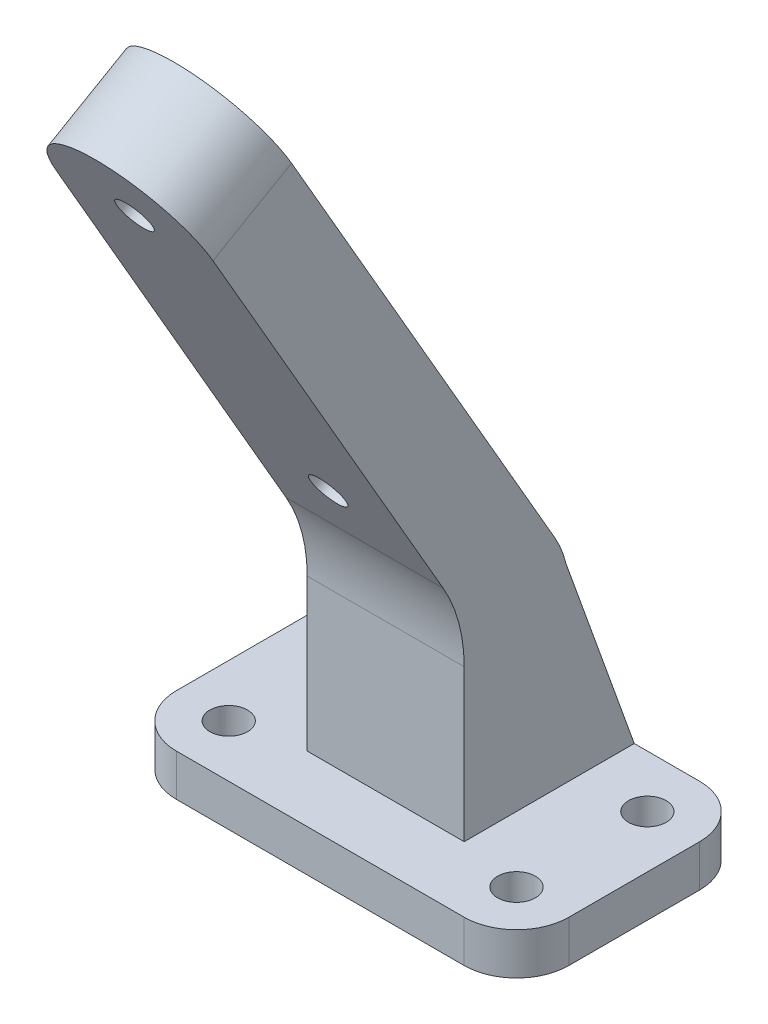
ISO-10303-21;
HEADER;
FILE_DESCRIPTION(('STEP AP214'),'2;1');
FILE_NAME('part.step','',(''),(''),'','','');
FILE_SCHEMA(('AUTOMOTIVE_DESIGN { 1 0 10303 214 1 1 1 1 }'));
ENDSEC;
DATA;
#1=APPLICATION_CONTEXT('core data for automotive mechanical design processes');
#2=APPLICATION_PROTOCOL_DEFINITION('international standard','automotive_design',2000,#1);
#3=PRODUCT_CONTEXT('',#1,'mechanical');
#4=PRODUCT('Part','Part','',(#3));
#5=PRODUCT_RELATED_PRODUCT_CATEGORY('part','',(#4));
#6=PRODUCT_DEFINITION_FORMATION('','',#4);
#7=PRODUCT_DEFINITION_CONTEXT('part definition',#1,'design');
#8=PRODUCT_DEFINITION('design','',#6,#7);
#9=PRODUCT_DEFINITION_SHAPE('','',#8);
#10=(LENGTH_UNIT() NAMED_UNIT(*) SI_UNIT(.MILLI.,.METRE.));
#11=(NAMED_UNIT(*) PLANE_ANGLE_UNIT() SI_UNIT($,.RADIAN.));
#12=(NAMED_UNIT(*) SI_UNIT($,.STERADIAN.) SOLID_ANGLE_UNIT());
#13=UNCERTAINTY_MEASURE_WITH_UNIT(LENGTH_MEASURE(1.E-05),#10,'distance_accuracy_value','');
#14=(GEOMETRIC_REPRESENTATION_CONTEXT(3) GLOBAL_UNCERTAINTY_ASSIGNED_CONTEXT((#13)) GLOBAL_UNIT_ASSIGNED_CONTEXT((#10,
#11,#12)) REPRESENTATION_CONTEXT('',''));
#15=CARTESIAN_POINT('',(0.,0.,0.));
#16=DIRECTION('',(0.,0.,1.));
#17=DIRECTION('',(1.,0.,0.));
#18=AXIS2_PLACEMENT_3D('',#15,#16,#17);
#19=CARTESIAN_POINT('',(11.25,22.5,-16.25));
#20=DIRECTION('',(0.,0.,1.));
#21=DIRECTION('',(1.,0.,0.));
#22=AXIS2_PLACEMENT_3D('',#19,#20,#21);
#23=PLANE('',#22);
#24=DIRECTION('',(0.,-1.,0.));
#25=VECTOR('',#24,1.);
#26=CARTESIAN_POINT('',(15.25,22.5,-16.25));
#27=LINE('',#26,#25);
#28=CARTESIAN_POINT('',(15.25,19.8205080756887,-16.25));
#29=VERTEX_POINT('',#28);
#30=CARTESIAN_POINT('',(15.25,4.,-16.25));
#31=VERTEX_POINT('',#30);
#32=EDGE_CURVE('E178',#29,#31,#27,.T.);
#33=ORIENTED_EDGE('',*,*,#32,.F.);
#34=DIRECTION('',(-1.,0.,0.));
#35=VECTOR('',#34,1.);
#36=CARTESIAN_POINT('',(26.25,19.8205080756887,-16.25));
#37=LINE('',#36,#35);
#38=CARTESIAN_POINT('',(22.25,19.8205080756887,-16.25));
#39=VERTEX_POINT('',#38);
#40=EDGE_CURVE('E62',#29,#39,#37,.F.);
#41=ORIENTED_EDGE('',*,*,#40,.T.);
#42=DIRECTION('',(0.,1.,0.));
#43=VECTOR('',#42,1.);
#44=CARTESIAN_POINT('',(22.25,22.5,-16.25));
#45=LINE('',#44,#43);
#46=CARTESIAN_POINT('',(22.25,4.,-16.25));
#47=VERTEX_POINT('',#46);
#48=EDGE_CURVE('E349',#47,#39,#45,.T.);
#49=ORIENTED_EDGE('',*,*,#48,.F.);
#50=DIRECTION('',(-1.,0.,0.));
#51=VECTOR('',#50,1.);
#52=CARTESIAN_POINT('',(11.25,4.,-16.25));
#53=LINE('',#52,#51);
#54=EDGE_CURVE('E334',#47,#31,#53,.T.);
#55=ORIENTED_EDGE('',*,*,#54,.T.);
#56=EDGE_LOOP('',(#33,#41,#49,#55));
#57=FACE_BOUND('',#56,.T.);
#58=ADVANCED_FACE('F39',(#57),#23,.F.);
#59=CARTESIAN_POINT('',(0.,4.,0.));
#60=DIRECTION('',(0.,-1.,0.));
#61=DIRECTION('',(0.,0.,-1.));
#62=AXIS2_PLACEMENT_3D('',#59,#60,#61);
#63=PLANE('',#62);
#64=DIRECTION('',(0.,0.,-1.));
#65=VECTOR('',#64,1.);
#66=CARTESIAN_POINT('',(15.25,4.,0.));
#67=LINE('',#66,#65);
#68=CARTESIAN_POINT('',(15.25,4.,-22.5));
#69=VERTEX_POINT('',#68);
#70=EDGE_CURVE('E176',#31,#69,#67,.T.);
#71=ORIENTED_EDGE('',*,*,#70,.F.);
#72=ORIENTED_EDGE('',*,*,#54,.F.);
#73=DIRECTION('',(0.,0.,1.));
#74=VECTOR('',#73,1.);
#75=CARTESIAN_POINT('',(22.25,4.,0.));
#76=LINE('',#75,#74);
#77=CARTESIAN_POINT('',(22.25,3.99999999999997,-22.5));
#78=VERTEX_POINT('',#77);
#79=EDGE_CURVE('E210',#78,#47,#76,.T.);
#80=ORIENTED_EDGE('',*,*,#79,.F.);
#81=DIRECTION('',(-1.,0.,0.));
#82=VECTOR('',#81,1.);
#83=CARTESIAN_POINT('',(0.,4.,-22.5));
#84=LINE('',#83,#82);
#85=EDGE_CURVE('E202',#78,#69,#84,.T.);
#86=ORIENTED_EDGE('',*,*,#85,.T.);
#87=EDGE_LOOP('',(#71,#72,#80,#86));
#88=FACE_BOUND('',#87,.T.);
#89=ADVANCED_FACE('F209',(#88),#63,.F.);
#90=DIRECTION('',(1.,0.,0.));
#91=VECTOR('',#90,1.);
#92=CARTESIAN_POINT('',(0.,4.,0.));
#93=LINE('',#92,#91);
#94=CARTESIAN_POINT('',(5.,4.,0.));
#95=VERTEX_POINT('',#94);
#96=CARTESIAN_POINT('',(32.5,4.,0.));
#97=VERTEX_POINT('',#96);
#98=EDGE_CURVE('E442',#95,#97,#93,.T.);
#99=ORIENTED_EDGE('',*,*,#98,.T.);
#100=CARTESIAN_POINT('',(32.5,4.,-5.));
#101=DIRECTION('',(0.,-1.,0.));
#102=DIRECTION('',(0.,0.,-1.));
#103=AXIS2_PLACEMENT_3D('',#100,#101,#102);
#104=CIRCLE('',#103,5.);
#105=CARTESIAN_POINT('',(37.5,4.,-5.));
#106=VERTEX_POINT('',#105);
#107=EDGE_CURVE('E297',#97,#106,#104,.F.);
#108=ORIENTED_EDGE('',*,*,#107,.T.);
#109=DIRECTION('',(0.,0.,-1.));
#110=VECTOR('',#109,1.);
#111=CARTESIAN_POINT('',(37.5,4.,0.));
#112=LINE('',#111,#110);
#113=CARTESIAN_POINT('',(37.5,4.,-17.5));
#114=VERTEX_POINT('',#113);
#115=EDGE_CURVE('E218',#106,#114,#112,.T.);
#116=ORIENTED_EDGE('',*,*,#115,.T.);
#117=CARTESIAN_POINT('',(32.5,4.,-17.5));
#118=DIRECTION('',(0.,-1.,0.));
#119=DIRECTION('',(0.,0.,-1.));
#120=AXIS2_PLACEMENT_3D('',#117,#118,#119);
#121=CIRCLE('',#120,5.);
#122=CARTESIAN_POINT('',(32.5,4.,-22.5));
#123=VERTEX_POINT('',#122);
#124=EDGE_CURVE('E294',#114,#123,#121,.F.);
#125=ORIENTED_EDGE('',*,*,#124,.T.);
#126=CARTESIAN_POINT('',(26.25,3.99999999999997,-22.5));
#127=VERTEX_POINT('',#126);
#128=EDGE_CURVE('E212',#123,#127,#84,.T.);
#129=ORIENTED_EDGE('',*,*,#128,.T.);
#130=DIRECTION('',(0.,0.,-1.));
#131=VECTOR('',#130,1.);
#132=CARTESIAN_POINT('',(26.25,4.,-16.25));
#133=LINE('',#132,#131);
#134=CARTESIAN_POINT('',(26.25,4.,-6.25));
#135=VERTEX_POINT('',#134);
#136=EDGE_CURVE('E429',#135,#127,#133,.T.);
#137=ORIENTED_EDGE('',*,*,#136,.F.);
#138=DIRECTION('',(1.,0.,0.));
#139=VECTOR('',#138,1.);
#140=CARTESIAN_POINT('',(11.25,4.,-6.25));
#141=LINE('',#140,#139);
#142=CARTESIAN_POINT('',(11.25,4.,-6.25));
#143=VERTEX_POINT('',#142);
#144=EDGE_CURVE('E426',#143,#135,#141,.T.);
#145=ORIENTED_EDGE('',*,*,#144,.F.);
#146=DIRECTION('',(0.,0.,1.));
#147=VECTOR('',#146,1.);
#148=CARTESIAN_POINT('',(11.25,4.,-16.25));
#149=LINE('',#148,#147);
#150=CARTESIAN_POINT('',(11.25,4.,-22.5));
#151=VERTEX_POINT('',#150);
#152=EDGE_CURVE('E413',#151,#143,#149,.T.);
#153=ORIENTED_EDGE('',*,*,#152,.F.);
#154=CARTESIAN_POINT('',(5.,4.,-22.5));
#155=VERTEX_POINT('',#154);
#156=EDGE_CURVE('E204',#151,#155,#84,.T.);
#157=ORIENTED_EDGE('',*,*,#156,.T.);
#158=CARTESIAN_POINT('',(5.,4.,-17.5));
#159=DIRECTION('',(0.,-1.,0.));
#160=DIRECTION('',(0.,0.,-1.));
#161=AXIS2_PLACEMENT_3D('',#158,#159,#160);
#162=CIRCLE('',#161,5.);
#163=CARTESIAN_POINT('',(0.,4.,-17.5));
#164=VERTEX_POINT('',#163);
#165=EDGE_CURVE('E288',#155,#164,#162,.F.);
#166=ORIENTED_EDGE('',*,*,#165,.T.);
#167=DIRECTION('',(0.,0.,1.));
#168=VECTOR('',#167,1.);
#169=CARTESIAN_POINT('',(0.,4.,0.));
#170=LINE('',#169,#168);
#171=CARTESIAN_POINT('',(0.,4.,-5.));
#172=VERTEX_POINT('',#171);
#173=EDGE_CURVE('E237',#164,#172,#170,.T.);
#174=ORIENTED_EDGE('',*,*,#173,.T.);
#175=CARTESIAN_POINT('',(5.,4.,-5.));
#176=DIRECTION('',(0.,-1.,0.));
#177=DIRECTION('',(0.,0.,-1.));
#178=AXIS2_PLACEMENT_3D('',#175,#176,#177);
#179=CIRCLE('',#178,5.);
#180=EDGE_CURVE('E291',#172,#95,#179,.F.);
#181=ORIENTED_EDGE('',*,*,#180,.T.);
#182=EDGE_LOOP('',(#99,#108,#116,#125,#129,#137,#145,#153,#157,#166,#174,#181));
#183=FACE_BOUND('',#182,.T.);
#184=CARTESIAN_POINT('',(5.,4.,-17.5));
#185=DIRECTION('',(0.,1.,0.));
#186=DIRECTION('',(0.,0.,1.));
#187=AXIS2_PLACEMENT_3D('',#184,#185,#186);
#188=CIRCLE('',#187,1.8);
#189=CARTESIAN_POINT('',(5.,4.,-15.7));
#190=VERTEX_POINT('',#189);
#191=EDGE_CURVE('E360',#190,#190,#188,.T.);
#192=ORIENTED_EDGE('',*,*,#191,.F.);
#193=EDGE_LOOP('',(#192));
#194=FACE_BOUND('',#193,.T.);
#195=CARTESIAN_POINT('',(5.,4.,-4.99999999999999));
#196=DIRECTION('',(0.,1.,0.));
#197=DIRECTION('',(0.,0.,-1.));
#198=AXIS2_PLACEMENT_3D('',#195,#196,#197);
#199=CIRCLE('',#198,1.8);
#200=CARTESIAN_POINT('',(5.,4.,-6.79999999999999));
#201=VERTEX_POINT('',#200);
#202=EDGE_CURVE('E355',#201,#201,#199,.T.);
#203=ORIENTED_EDGE('',*,*,#202,.F.);
#204=EDGE_LOOP('',(#203));
#205=FACE_BOUND('',#204,.T.);
#206=CARTESIAN_POINT('',(32.5,4.,-17.5));
#207=DIRECTION('',(0.,1.,0.));
#208=DIRECTION('',(0.,0.,-1.));
#209=AXIS2_PLACEMENT_3D('',#206,#207,#208);
#210=CIRCLE('',#209,1.8);
#211=CARTESIAN_POINT('',(32.5,4.,-19.3));
#212=VERTEX_POINT('',#211);
#213=EDGE_CURVE('E361',#212,#212,#210,.T.);
#214=ORIENTED_EDGE('',*,*,#213,.F.);
#215=EDGE_LOOP('',(#214));
#216=FACE_BOUND('',#215,.T.);
#217=CARTESIAN_POINT('',(32.5,4.,-4.99999999999999));
#218=DIRECTION('',(0.,1.,0.));
#219=DIRECTION('',(0.,0.,1.));
#220=AXIS2_PLACEMENT_3D('',#217,#218,#219);
#221=CIRCLE('',#220,1.8);
#222=CARTESIAN_POINT('',(32.5,4.,-3.19999999999999));
#223=VERTEX_POINT('',#222);
#224=EDGE_CURVE('E369',#223,#223,#221,.T.);
#225=ORIENTED_EDGE('',*,*,#224,.F.);
#226=EDGE_LOOP('',(#225));
#227=FACE_BOUND('',#226,.T.);
#228=ADVANCED_FACE('F450',(#183,#194,#205,#216,#227),#63,.F.);
#229=CARTESIAN_POINT('',(0.,4.,0.));
#230=DIRECTION('',(1.,0.,0.));
#231=DIRECTION('',(0.,0.,-1.));
#232=AXIS2_PLACEMENT_3D('',#229,#230,#231);
#233=PLANE('',#232);
#234=DIRECTION('',(0.,0.,1.));
#235=VECTOR('',#234,1.);
#236=CARTESIAN_POINT('',(0.,0.,0.));
#237=LINE('',#236,#235);
#238=CARTESIAN_POINT('',(0.,0.,-17.5));
#239=VERTEX_POINT('',#238);
#240=CARTESIAN_POINT('',(0.,0.,-5.));
#241=VERTEX_POINT('',#240);
#242=EDGE_CURVE('E222',#239,#241,#237,.T.);
#243=ORIENTED_EDGE('',*,*,#242,.T.);
#244=DIRECTION('',(0.,-1.,0.));
#245=VECTOR('',#244,1.);
#246=CARTESIAN_POINT('',(0.,4.,-5.));
#247=LINE('',#246,#245);
#248=EDGE_CURVE('E311',#241,#172,#247,.F.);
#249=ORIENTED_EDGE('',*,*,#248,.T.);
#250=ORIENTED_EDGE('',*,*,#173,.F.);
#251=DIRECTION('',(0.,-1.,0.));
#252=VECTOR('',#251,1.);
#253=CARTESIAN_POINT('',(0.,4.,-17.5));
#254=LINE('',#253,#252);
#255=EDGE_CURVE('E307',#164,#239,#254,.T.);
#256=ORIENTED_EDGE('',*,*,#255,.T.);
#257=EDGE_LOOP('',(#243,#249,#250,#256));
#258=FACE_BOUND('',#257,.T.);
#259=ADVANCED_FACE('F474',(#258),#233,.F.);
#260=CARTESIAN_POINT('',(0.,4.,0.));
#261=DIRECTION('',(0.,0.,-1.));
#262=DIRECTION('',(-1.,0.,0.));
#263=AXIS2_PLACEMENT_3D('',#260,#261,#262);
#264=PLANE('',#263);
#265=DIRECTION('',(1.,0.,0.));
#266=VECTOR('',#265,1.);
#267=CARTESIAN_POINT('',(0.,0.,0.));
#268=LINE('',#267,#266);
#269=CARTESIAN_POINT('',(5.,0.,0.));
#270=VERTEX_POINT('',#269);
#271=CARTESIAN_POINT('',(32.5,0.,0.));
#272=VERTEX_POINT('',#271);
#273=EDGE_CURVE('E226',#270,#272,#268,.T.);
#274=ORIENTED_EDGE('',*,*,#273,.T.);
#275=DIRECTION('',(0.,-1.,0.));
#276=VECTOR('',#275,1.);
#277=CARTESIAN_POINT('',(32.5,4.,0.));
#278=LINE('',#277,#276);
#279=EDGE_CURVE('E284',#272,#97,#278,.F.);
#280=ORIENTED_EDGE('',*,*,#279,.T.);
#281=ORIENTED_EDGE('',*,*,#98,.F.);
#282=DIRECTION('',(0.,-1.,0.));
#283=VECTOR('',#282,1.);
#284=CARTESIAN_POINT('',(5.,4.,0.));
#285=LINE('',#284,#283);
#286=EDGE_CURVE('E280',#95,#270,#285,.T.);
#287=ORIENTED_EDGE('',*,*,#286,.T.);
#288=EDGE_LOOP('',(#274,#280,#281,#287));
#289=FACE_BOUND('',#288,.T.);
#290=ADVANCED_FACE('F480',(#289),#264,.F.);
#291=CARTESIAN_POINT('',(37.5,4.,0.));
#292=DIRECTION('',(-1.,0.,0.));
#293=DIRECTION('',(0.,0.,1.));
#294=AXIS2_PLACEMENT_3D('',#291,#292,#293);
#295=PLANE('',#294);
#296=ORIENTED_EDGE('',*,*,#115,.F.);
#297=DIRECTION('',(0.,-1.,0.));
#298=VECTOR('',#297,1.);
#299=CARTESIAN_POINT('',(37.5,4.,-5.));
#300=LINE('',#299,#298);
#301=CARTESIAN_POINT('',(37.5,0.,-5.));
#302=VERTEX_POINT('',#301);
#303=EDGE_CURVE('E262',#106,#302,#300,.T.);
#304=ORIENTED_EDGE('',*,*,#303,.T.);
#305=DIRECTION('',(0.,0.,-1.));
#306=VECTOR('',#305,1.);
#307=CARTESIAN_POINT('',(37.5,0.,0.));
#308=LINE('',#307,#306);
#309=CARTESIAN_POINT('',(37.5,0.,-17.5));
#310=VERTEX_POINT('',#309);
#311=EDGE_CURVE('E230',#302,#310,#308,.T.);
#312=ORIENTED_EDGE('',*,*,#311,.T.);
#313=DIRECTION('',(0.,-1.,0.));
#314=VECTOR('',#313,1.);
#315=CARTESIAN_POINT('',(37.5,4.,-17.5));
#316=LINE('',#315,#314);
#317=EDGE_CURVE('E259',#310,#114,#316,.F.);
#318=ORIENTED_EDGE('',*,*,#317,.T.);
#319=EDGE_LOOP('',(#296,#304,#312,#318));
#320=FACE_BOUND('',#319,.T.);
#321=ADVANCED_FACE('F485',(#320),#295,.F.);
#322=CARTESIAN_POINT('',(0.,4.,-22.5));
#323=DIRECTION('',(0.,0.,1.));
#324=DIRECTION('',(1.,0.,0.));
#325=AXIS2_PLACEMENT_3D('',#322,#323,#324);
#326=PLANE('',#325);
#327=ORIENTED_EDGE('',*,*,#156,.F.);
#328=DIRECTION('',(1.,0.,0.));
#329=VECTOR('',#328,1.);
#330=CARTESIAN_POINT('',(0.,4.,-22.5));
#331=LINE('',#330,#329);
#332=EDGE_CURVE('E184',#69,#151,#331,.F.);
#333=ORIENTED_EDGE('',*,*,#332,.F.);
#334=ORIENTED_EDGE('',*,*,#85,.F.);
#335=DIRECTION('',(-1.,0.,0.));
#336=VECTOR('',#335,1.);
#337=CARTESIAN_POINT('',(0.,3.99999999999997,-22.5));
#338=LINE('',#337,#336);
#339=EDGE_CURVE('E352',#127,#78,#338,.T.);
#340=ORIENTED_EDGE('',*,*,#339,.F.);
#341=ORIENTED_EDGE('',*,*,#128,.F.);
#342=DIRECTION('',(0.,-1.,0.));
#343=VECTOR('',#342,1.);
#344=CARTESIAN_POINT('',(32.5,4.,-22.5));
#345=LINE('',#344,#343);
#346=CARTESIAN_POINT('',(32.5,0.,-22.5));
#347=VERTEX_POINT('',#346);
#348=EDGE_CURVE('E303',#123,#347,#345,.T.);
#349=ORIENTED_EDGE('',*,*,#348,.T.);
#350=DIRECTION('',(-1.,0.,0.));
#351=VECTOR('',#350,1.);
#352=CARTESIAN_POINT('',(0.,0.,-22.5));
#353=LINE('',#352,#351);
#354=CARTESIAN_POINT('',(5.,0.,-22.5));
#355=VERTEX_POINT('',#354);
#356=EDGE_CURVE('E234',#347,#355,#353,.T.);
#357=ORIENTED_EDGE('',*,*,#356,.T.);
#358=DIRECTION('',(0.,-1.,0.));
#359=VECTOR('',#358,1.);
#360=CARTESIAN_POINT('',(5.,4.,-22.5));
#361=LINE('',#360,#359);
#362=EDGE_CURVE('E300',#355,#155,#361,.F.);
#363=ORIENTED_EDGE('',*,*,#362,.T.);
#364=EDGE_LOOP('',(#327,#333,#334,#340,#341,#349,#357,#363));
#365=FACE_BOUND('',#364,.T.);
#366=ADVANCED_FACE('F200',(#365),#326,.F.);
#367=CARTESIAN_POINT('',(0.,0.,0.));
#368=DIRECTION('',(0.,-1.,0.));
#369=DIRECTION('',(0.,0.,-1.));
#370=AXIS2_PLACEMENT_3D('',#367,#368,#369);
#371=PLANE('',#370);
#372=CARTESIAN_POINT('',(5.,0.,-17.5));
#373=DIRECTION('',(0.,-1.,0.));
#374=DIRECTION('',(0.,0.,-1.));
#375=AXIS2_PLACEMENT_3D('',#372,#373,#374);
#376=CIRCLE('',#375,5.);
#377=EDGE_CURVE('E266',#239,#355,#376,.T.);
#378=ORIENTED_EDGE('',*,*,#377,.T.);
#379=ORIENTED_EDGE('',*,*,#356,.F.);
#380=CARTESIAN_POINT('',(32.5,0.,-17.5));
#381=DIRECTION('',(0.,-1.,0.));
#382=DIRECTION('',(0.,0.,-1.));
#383=AXIS2_PLACEMENT_3D('',#380,#381,#382);
#384=CIRCLE('',#383,5.);
#385=EDGE_CURVE('E273',#347,#310,#384,.T.);
#386=ORIENTED_EDGE('',*,*,#385,.T.);
#387=ORIENTED_EDGE('',*,*,#311,.F.);
#388=CARTESIAN_POINT('',(32.5,0.,-5.));
#389=DIRECTION('',(0.,-1.,0.));
#390=DIRECTION('',(0.,0.,-1.));
#391=AXIS2_PLACEMENT_3D('',#388,#389,#390);
#392=CIRCLE('',#391,5.);
#393=EDGE_CURVE('E276',#302,#272,#392,.T.);
#394=ORIENTED_EDGE('',*,*,#393,.T.);
#395=ORIENTED_EDGE('',*,*,#273,.F.);
#396=CARTESIAN_POINT('',(5.,0.,-5.));
#397=DIRECTION('',(0.,-1.,0.));
#398=DIRECTION('',(0.,0.,-1.));
#399=AXIS2_PLACEMENT_3D('',#396,#397,#398);
#400=CIRCLE('',#399,5.);
#401=EDGE_CURVE('E270',#270,#241,#400,.T.);
#402=ORIENTED_EDGE('',*,*,#401,.T.);
#403=ORIENTED_EDGE('',*,*,#242,.F.);
#404=EDGE_LOOP('',(#378,#379,#386,#387,#394,#395,#402,#403));
#405=FACE_BOUND('',#404,.T.);
#406=CARTESIAN_POINT('',(5.,0.,-17.5));
#407=DIRECTION('',(0.,1.,0.));
#408=DIRECTION('',(0.,0.,1.));
#409=AXIS2_PLACEMENT_3D('',#406,#407,#408);
#410=CIRCLE('',#409,1.8);
#411=CARTESIAN_POINT('',(5.,0.,-15.7));
#412=VERTEX_POINT('',#411);
#413=EDGE_CURVE('E380',#412,#412,#410,.T.);
#414=ORIENTED_EDGE('',*,*,#413,.T.);
#415=EDGE_LOOP('',(#414));
#416=FACE_BOUND('',#415,.T.);
#417=CARTESIAN_POINT('',(5.,0.,-4.99999999999999));
#418=DIRECTION('',(0.,1.,0.));
#419=DIRECTION('',(0.,0.,-1.));
#420=AXIS2_PLACEMENT_3D('',#417,#418,#419);
#421=CIRCLE('',#420,1.8);
#422=CARTESIAN_POINT('',(5.,0.,-6.79999999999999));
#423=VERTEX_POINT('',#422);
#424=EDGE_CURVE('E373',#423,#423,#421,.T.);
#425=ORIENTED_EDGE('',*,*,#424,.T.);
#426=EDGE_LOOP('',(#425));
#427=FACE_BOUND('',#426,.T.);
#428=CARTESIAN_POINT('',(32.5,0.,-17.5));
#429=DIRECTION('',(0.,1.,0.));
#430=DIRECTION('',(0.,0.,-1.));
#431=AXIS2_PLACEMENT_3D('',#428,#429,#430);
#432=CIRCLE('',#431,1.8);
#433=CARTESIAN_POINT('',(32.5,0.,-19.3));
#434=VERTEX_POINT('',#433);
#435=EDGE_CURVE('E356',#434,#434,#432,.T.);
#436=ORIENTED_EDGE('',*,*,#435,.T.);
#437=EDGE_LOOP('',(#436));
#438=FACE_BOUND('',#437,.T.);
#439=CARTESIAN_POINT('',(32.5,0.,-4.99999999999999));
#440=DIRECTION('',(0.,1.,0.));
#441=DIRECTION('',(0.,0.,1.));
#442=AXIS2_PLACEMENT_3D('',#439,#440,#441);
#443=CIRCLE('',#442,1.8);
#444=CARTESIAN_POINT('',(32.5,0.,-3.19999999999999));
#445=VERTEX_POINT('',#444);
#446=EDGE_CURVE('E365',#445,#445,#443,.T.);
#447=ORIENTED_EDGE('',*,*,#446,.T.);
#448=EDGE_LOOP('',(#447));
#449=FACE_BOUND('',#448,.T.);
#450=ADVANCED_FACE('F462',(#405,#416,#427,#438,#449),#371,.T.);
#451=CARTESIAN_POINT('',(11.25,22.5,-16.25));
#452=DIRECTION('',(1.,0.,0.));
#453=DIRECTION('',(0.,0.,-1.));
#454=AXIS2_PLACEMENT_3D('',#451,#452,#453);
#455=PLANE('',#454);
#456=DIRECTION('',(0.,0.940949854760072,0.338545965604375));
#457=VECTOR('',#456,1.);
#458=CARTESIAN_POINT('',(11.25,4.,-22.5));
#459=LINE('',#458,#457);
#460=CARTESIAN_POINT('',(11.25,22.1083016325887,-15.9847830299913));
#461=VERTEX_POINT('',#460);
#462=EDGE_CURVE('E195',#151,#461,#459,.T.);
#463=ORIENTED_EDGE('',*,*,#462,.F.);
#464=ORIENTED_EDGE('',*,*,#152,.T.);
#465=DIRECTION('',(0.,-1.,0.));
#466=VECTOR('',#465,1.);
#467=CARTESIAN_POINT('',(11.25,22.5,-6.25));
#468=LINE('',#467,#466);
#469=CARTESIAN_POINT('',(11.25,18.4807621135331,-6.25));
#470=VERTEX_POINT('',#469);
#471=EDGE_CURVE('E227',#470,#143,#468,.T.);
#472=ORIENTED_EDGE('',*,*,#471,.F.);
#473=CARTESIAN_POINT('',(11.25,18.4807621135331,8.75));
#474=DIRECTION('',(1.,0.,0.));
#475=DIRECTION('',(0.,0.,-1.));
#476=AXIS2_PLACEMENT_3D('',#473,#474,#475);
#477=CIRCLE('',#476,15.);
#478=CARTESIAN_POINT('',(11.25,25.9807621135332,-4.24038105676654));
#479=VERTEX_POINT('',#478);
#480=EDGE_CURVE('E256',#470,#479,#477,.T.);
#481=ORIENTED_EDGE('',*,*,#480,.T.);
#482=DIRECTION('',(0.,-0.866025403784436,-0.500000000000004));
#483=VECTOR('',#482,1.);
#484=CARTESIAN_POINT('',(11.25,22.5,-6.25));
#485=LINE('',#484,#483);
#486=CARTESIAN_POINT('',(11.25,64.0692193816529,17.7500000000002));
#487=VERTEX_POINT('',#486);
#488=EDGE_CURVE('E409',#487,#479,#485,.T.);
#489=ORIENTED_EDGE('',*,*,#488,.F.);
#490=DIRECTION('',(0.,-0.500000000000004,0.866025403784436));
#491=VECTOR('',#490,1.);
#492=CARTESIAN_POINT('',(11.25,64.0692193816529,17.7500000000002));
#493=LINE('',#492,#491);
#494=CARTESIAN_POINT('',(11.25,68.399346401653,10.2499999981334));
#495=VERTEX_POINT('',#494);
#496=EDGE_CURVE('E404',#495,#487,#493,.T.);
#497=ORIENTED_EDGE('',*,*,#496,.F.);
#498=DIRECTION('',(0.,0.866025403784436,0.500000000000004));
#499=VECTOR('',#498,1.);
#500=CARTESIAN_POINT('',(11.25,22.5,-16.25));
#501=LINE('',#500,#499);
#502=CARTESIAN_POINT('',(11.25,24.8205080756888,-14.9102540378444));
#503=VERTEX_POINT('',#502);
#504=EDGE_CURVE('E400',#503,#495,#501,.T.);
#505=ORIENTED_EDGE('',*,*,#504,.F.);
#506=CARTESIAN_POINT('',(11.25,19.8205080756887,-6.25));
#507=DIRECTION('',(1.,0.,0.));
#508=DIRECTION('',(0.,0.,-1.));
#509=AXIS2_PLACEMENT_3D('',#506,#507,#508);
#510=CIRCLE('',#509,10.);
#511=EDGE_CURVE('E317',#503,#461,#510,.F.);
#512=ORIENTED_EDGE('',*,*,#511,.T.);
#513=EDGE_LOOP('',(#463,#464,#472,#481,#489,#497,#505,#512));
#514=FACE_BOUND('',#513,.T.);
#515=ADVANCED_FACE('F512',(#514),#455,.F.);
#516=CARTESIAN_POINT('',(11.25,22.5,-6.25));
#517=DIRECTION('',(0.,0.,-1.));
#518=DIRECTION('',(-1.,0.,0.));
#519=AXIS2_PLACEMENT_3D('',#516,#517,#518);
#520=PLANE('',#519);
#521=ORIENTED_EDGE('',*,*,#144,.T.);
#522=DIRECTION('',(0.,-1.,0.));
#523=VECTOR('',#522,1.);
#524=CARTESIAN_POINT('',(26.25,22.5,-6.25));
#525=LINE('',#524,#523);
#526=CARTESIAN_POINT('',(26.25,18.4807621135331,-6.25));
#527=VERTEX_POINT('',#526);
#528=EDGE_CURVE('E434',#527,#135,#525,.T.);
#529=ORIENTED_EDGE('',*,*,#528,.F.);
#530=DIRECTION('',(1.,0.,0.));
#531=VECTOR('',#530,1.);
#532=CARTESIAN_POINT('',(11.25,18.4807621135331,-6.25));
#533=LINE('',#532,#531);
#534=EDGE_CURVE('E250',#527,#470,#533,.F.);
#535=ORIENTED_EDGE('',*,*,#534,.T.);
#536=ORIENTED_EDGE('',*,*,#471,.T.);
#537=EDGE_LOOP('',(#521,#529,#535,#536));
#538=FACE_BOUND('',#537,.T.);
#539=ADVANCED_FACE('F508',(#538),#520,.F.);
#540=CARTESIAN_POINT('',(26.25,22.5,-16.25));
#541=DIRECTION('',(-1.,0.,0.));
#542=DIRECTION('',(0.,0.,1.));
#543=AXIS2_PLACEMENT_3D('',#540,#541,#542);
#544=PLANE('',#543);
#545=ORIENTED_EDGE('',*,*,#136,.T.);
#546=DIRECTION('',(0.,0.941051653318184,0.338262894487576));
#547=VECTOR('',#546,1.);
#548=CARTESIAN_POINT('',(26.25,4.,-22.5));
#549=LINE('',#548,#547);
#550=CARTESIAN_POINT('',(26.25,22.1588520838137,-15.9727643856913));
#551=VERTEX_POINT('',#550);
#552=EDGE_CURVE('E340',#127,#551,#549,.T.);
#553=ORIENTED_EDGE('',*,*,#552,.T.);
#554=CARTESIAN_POINT('',(26.25,19.8205080756887,-6.25));
#555=DIRECTION('',(-1.,0.,0.));
#556=DIRECTION('',(0.,0.,1.));
#557=AXIS2_PLACEMENT_3D('',#554,#555,#556);
#558=CIRCLE('',#557,10.);
#559=CARTESIAN_POINT('',(26.25,24.8205080756888,-14.9102540378444));
#560=VERTEX_POINT('',#559);
#561=EDGE_CURVE('E322',#551,#560,#558,.F.);
#562=ORIENTED_EDGE('',*,*,#561,.T.);
#563=DIRECTION('',(0.,0.866025403784436,0.500000000000004));
#564=VECTOR('',#563,1.);
#565=CARTESIAN_POINT('',(26.25,22.5,-16.25));
#566=LINE('',#565,#564);
#567=CARTESIAN_POINT('',(26.25,68.3993464005752,10.2500000000002));
#568=VERTEX_POINT('',#567);
#569=EDGE_CURVE('E397',#560,#568,#566,.T.);
#570=ORIENTED_EDGE('',*,*,#569,.T.);
#571=DIRECTION('',(0.,-0.500000000000004,0.866025403784436));
#572=VECTOR('',#571,1.);
#573=CARTESIAN_POINT('',(26.25,64.0692193816529,17.7500000000002));
#574=LINE('',#573,#572);
#575=CARTESIAN_POINT('',(26.25,64.0692193816529,17.7500000000002));
#576=VERTEX_POINT('',#575);
#577=EDGE_CURVE('E416',#568,#576,#574,.T.);
#578=ORIENTED_EDGE('',*,*,#577,.T.);
#579=DIRECTION('',(0.,-0.866025403784436,-0.500000000000004));
#580=VECTOR('',#579,1.);
#581=CARTESIAN_POINT('',(26.25,22.5,-6.25));
#582=LINE('',#581,#580);
#583=CARTESIAN_POINT('',(26.25,25.9807621135332,-4.24038105676654));
#584=VERTEX_POINT('',#583);
#585=EDGE_CURVE('E405',#576,#584,#582,.T.);
#586=ORIENTED_EDGE('',*,*,#585,.T.);
#587=CARTESIAN_POINT('',(26.25,18.4807621135331,8.75));
#588=DIRECTION('',(-1.,0.,0.));
#589=DIRECTION('',(0.,0.,1.));
#590=AXIS2_PLACEMENT_3D('',#587,#588,#589);
#591=CIRCLE('',#590,15.);
#592=EDGE_CURVE('E253',#584,#527,#591,.T.);
#593=ORIENTED_EDGE('',*,*,#592,.T.);
#594=ORIENTED_EDGE('',*,*,#528,.T.);
#595=EDGE_LOOP('',(#545,#553,#562,#570,#578,#586,#593,#594));
#596=FACE_BOUND('',#595,.T.);
#597=ADVANCED_FACE('F504',(#596),#544,.F.);
#598=CARTESIAN_POINT('',(11.25,22.5,-6.25));
#599=DIRECTION('',(0.,-0.500000000000004,0.866025403784436));
#600=DIRECTION('',(0.,-0.866025403784436,-0.500000000000004));
#601=AXIS2_PLACEMENT_3D('',#598,#599,#600);
#602=PLANE('',#601);
#603=DIRECTION('',(1.,0.,0.));
#604=VECTOR('',#603,1.);
#605=CARTESIAN_POINT('',(11.25,25.9807621135332,-4.24038105676654));
#606=LINE('',#605,#604);
#607=EDGE_CURVE('E217',#479,#584,#606,.T.);
#608=ORIENTED_EDGE('',*,*,#607,.T.);
#609=ORIENTED_EDGE('',*,*,#585,.F.);
#610=CARTESIAN_POINT('',(18.75,64.0692193816529,17.7500000000002));
#611=DIRECTION('',(0.,-0.500000000000004,0.866025403784436));
#612=DIRECTION('',(0.,-0.866025403784436,-0.500000000000004));
#613=AXIS2_PLACEMENT_3D('',#610,#611,#612);
#614=CIRCLE('',#613,7.5);
#615=EDGE_CURVE('E247',#576,#487,#614,.T.);
#616=ORIENTED_EDGE('',*,*,#615,.T.);
#617=ORIENTED_EDGE('',*,*,#488,.T.);
#618=EDGE_LOOP('',(#608,#609,#616,#617));
#619=FACE_BOUND('',#618,.T.);
#620=CARTESIAN_POINT('',(18.75,64.0692193816529,17.7500000000002));
#621=DIRECTION('',(0.,-0.500000000000004,0.866025403784436));
#622=DIRECTION('',(0.,-0.866025403784436,-0.500000000000004));
#623=AXIS2_PLACEMENT_3D('',#620,#621,#622);
#624=CIRCLE('',#623,1.7);
#625=CARTESIAN_POINT('',(18.75,62.5969761952194,16.9000000000002));
#626=VERTEX_POINT('',#625);
#627=EDGE_CURVE('E243',#626,#626,#624,.T.);
#628=ORIENTED_EDGE('',*,*,#627,.F.);
#629=EDGE_LOOP('',(#628));
#630=FACE_BOUND('',#629,.T.);
#631=CARTESIAN_POINT('',(18.75,32.0262794416288,-0.749999999999966));
#632=DIRECTION('',(0.,-0.500000000000004,0.866025403784436));
#633=DIRECTION('',(0.,-0.866025403784436,-0.500000000000004));
#634=AXIS2_PLACEMENT_3D('',#631,#632,#633);
#635=CIRCLE('',#634,1.7);
#636=CARTESIAN_POINT('',(18.75,30.5540362551953,-1.59999999999997));
#637=VERTEX_POINT('',#636);
#638=EDGE_CURVE('E384',#637,#637,#635,.T.);
#639=ORIENTED_EDGE('',*,*,#638,.F.);
#640=EDGE_LOOP('',(#639));
#641=FACE_BOUND('',#640,.T.);
#642=ADVANCED_FACE('F507',(#619,#630,#641),#602,.T.);
#643=CARTESIAN_POINT('',(11.25,22.5,-16.25));
#644=DIRECTION('',(0.,0.500000000000004,-0.866025403784436));
#645=DIRECTION('',(0.,0.866025403784436,0.500000000000004));
#646=AXIS2_PLACEMENT_3D('',#643,#644,#645);
#647=PLANE('',#646);
#648=ORIENTED_EDGE('',*,*,#504,.T.);
#649=CARTESIAN_POINT('',(18.75,68.399346401653,10.2499999981334));
#650=DIRECTION('',(0.,-0.500000000000004,0.866025403784436));
#651=DIRECTION('',(0.,-0.866025403784436,-0.500000000000004));
#652=AXIS2_PLACEMENT_3D('',#649,#650,#651);
#653=CIRCLE('',#652,7.5);
#654=EDGE_CURVE('E394',#568,#495,#653,.T.);
#655=ORIENTED_EDGE('',*,*,#654,.F.);
#656=ORIENTED_EDGE('',*,*,#569,.F.);
#657=DIRECTION('',(-1.,0.,0.));
#658=VECTOR('',#657,1.);
#659=CARTESIAN_POINT('',(11.25,24.8205080756888,-14.9102540378444));
#660=LINE('',#659,#658);
#661=EDGE_CURVE('E314',#560,#503,#660,.T.);
#662=ORIENTED_EDGE('',*,*,#661,.T.);
#663=EDGE_LOOP('',(#648,#655,#656,#662));
#664=FACE_BOUND('',#663,.T.);
#665=CARTESIAN_POINT('',(18.75,68.3993464005752,10.2500000000002));
#666=DIRECTION('',(0.,0.500000000000004,-0.866025403784436));
#667=DIRECTION('',(0.,0.866025403784436,0.500000000000004));
#668=AXIS2_PLACEMENT_3D('',#665,#666,#667);
#669=CIRCLE('',#668,1.7);
#670=CARTESIAN_POINT('',(18.75,69.8715895870087,11.1000000000003));
#671=VERTEX_POINT('',#670);
#672=EDGE_CURVE('E242',#671,#671,#669,.T.);
#673=ORIENTED_EDGE('',*,*,#672,.F.);
#674=EDGE_LOOP('',(#673));
#675=FACE_BOUND('',#674,.T.);
#676=CARTESIAN_POINT('',(18.75,36.356406460551,-8.24999999999991));
#677=DIRECTION('',(0.,0.500000000000004,-0.866025403784436));
#678=DIRECTION('',(0.,0.866025403784436,0.500000000000004));
#679=AXIS2_PLACEMENT_3D('',#676,#677,#678);
#680=CIRCLE('',#679,1.7);
#681=CARTESIAN_POINT('',(18.75,37.8286496469846,-7.39999999999991));
#682=VERTEX_POINT('',#681);
#683=EDGE_CURVE('E238',#682,#682,#680,.T.);
#684=ORIENTED_EDGE('',*,*,#683,.F.);
#685=EDGE_LOOP('',(#684));
#686=FACE_BOUND('',#685,.T.);
#687=ADVANCED_FACE('F502',(#664,#675,#686),#647,.T.);
#688=CARTESIAN_POINT('',(18.75,68.399346401653,10.2499999981334));
#689=DIRECTION('',(0.,-0.500000000000004,0.866025403784436));
#690=DIRECTION('',(0.,-0.866025403784436,-0.500000000000004));
#691=AXIS2_PLACEMENT_3D('',#688,#689,#690);
#692=CYLINDRICAL_SURFACE('',#691,7.5);
#693=ORIENTED_EDGE('',*,*,#496,.T.);
#694=ORIENTED_EDGE('',*,*,#615,.F.);
#695=ORIENTED_EDGE('',*,*,#577,.F.);
#696=ORIENTED_EDGE('',*,*,#654,.T.);
#697=EDGE_LOOP('',(#693,#694,#695,#696));
#698=FACE_BOUND('',#697,.T.);
#699=ADVANCED_FACE('F549',(#698),#692,.T.);
#700=CARTESIAN_POINT('',(18.75,37.0262794416288,-9.41025403784433));
#701=DIRECTION('',(0.,-0.500000000000004,0.866025403784436));
#702=DIRECTION('',(0.,-0.866025403784436,-0.500000000000004));
#703=AXIS2_PLACEMENT_3D('',#700,#701,#702);
#704=CYLINDRICAL_SURFACE('',#703,1.7);
#705=ORIENTED_EDGE('',*,*,#683,.T.);
#706=EDGE_LOOP('',(#705));
#707=FACE_BOUND('',#706,.T.);
#708=ORIENTED_EDGE('',*,*,#638,.T.);
#709=EDGE_LOOP('',(#708));
#710=FACE_BOUND('',#709,.T.);
#711=ADVANCED_FACE('F556',(#707,#710),#704,.F.);
#712=CARTESIAN_POINT('',(18.75,69.069219381653,9.08974596215582));
#713=DIRECTION('',(0.,-0.500000000000004,0.866025403784436));
#714=DIRECTION('',(0.,-0.866025403784436,-0.500000000000004));
#715=AXIS2_PLACEMENT_3D('',#712,#713,#714);
#716=CYLINDRICAL_SURFACE('',#715,1.7);
#717=ORIENTED_EDGE('',*,*,#672,.T.);
#718=EDGE_LOOP('',(#717));
#719=FACE_BOUND('',#718,.T.);
#720=ORIENTED_EDGE('',*,*,#627,.T.);
#721=EDGE_LOOP('',(#720));
#722=FACE_BOUND('',#721,.T.);
#723=ADVANCED_FACE('F565',(#719,#722),#716,.F.);
#724=CARTESIAN_POINT('',(11.25,18.4807621135331,8.75));
#725=DIRECTION('',(1.,0.,0.));
#726=DIRECTION('',(0.,0.,-1.));
#727=AXIS2_PLACEMENT_3D('',#724,#725,#726);
#728=CYLINDRICAL_SURFACE('',#727,15.);
#729=ORIENTED_EDGE('',*,*,#480,.F.);
#730=ORIENTED_EDGE('',*,*,#534,.F.);
#731=ORIENTED_EDGE('',*,*,#592,.F.);
#732=ORIENTED_EDGE('',*,*,#607,.F.);
#733=EDGE_LOOP('',(#729,#730,#731,#732));
#734=FACE_BOUND('',#733,.T.);
#735=ADVANCED_FACE('F573',(#734),#728,.F.);
#736=CARTESIAN_POINT('',(32.5,4.,-5.));
#737=DIRECTION('',(0.,-1.,0.));
#738=DIRECTION('',(0.,0.,-1.));
#739=AXIS2_PLACEMENT_3D('',#736,#737,#738);
#740=CYLINDRICAL_SURFACE('',#739,5.);
#741=ORIENTED_EDGE('',*,*,#107,.F.);
#742=ORIENTED_EDGE('',*,*,#279,.F.);
#743=ORIENTED_EDGE('',*,*,#393,.F.);
#744=ORIENTED_EDGE('',*,*,#303,.F.);
#745=EDGE_LOOP('',(#741,#742,#743,#744));
#746=FACE_BOUND('',#745,.T.);
#747=ADVANCED_FACE('F484',(#746),#740,.T.);
#748=CARTESIAN_POINT('',(32.5,4.,-17.5));
#749=DIRECTION('',(0.,-1.,0.));
#750=DIRECTION('',(0.,0.,-1.));
#751=AXIS2_PLACEMENT_3D('',#748,#749,#750);
#752=CYLINDRICAL_SURFACE('',#751,5.);
#753=ORIENTED_EDGE('',*,*,#124,.F.);
#754=ORIENTED_EDGE('',*,*,#317,.F.);
#755=ORIENTED_EDGE('',*,*,#385,.F.);
#756=ORIENTED_EDGE('',*,*,#348,.F.);
#757=EDGE_LOOP('',(#753,#754,#755,#756));
#758=FACE_BOUND('',#757,.T.);
#759=ADVANCED_FACE('F459',(#758),#752,.T.);
#760=CARTESIAN_POINT('',(5.,4.,-5.));
#761=DIRECTION('',(0.,-1.,0.));
#762=DIRECTION('',(0.,0.,-1.));
#763=AXIS2_PLACEMENT_3D('',#760,#761,#762);
#764=CYLINDRICAL_SURFACE('',#763,5.);
#765=ORIENTED_EDGE('',*,*,#180,.F.);
#766=ORIENTED_EDGE('',*,*,#248,.F.);
#767=ORIENTED_EDGE('',*,*,#401,.F.);
#768=ORIENTED_EDGE('',*,*,#286,.F.);
#769=EDGE_LOOP('',(#765,#766,#767,#768));
#770=FACE_BOUND('',#769,.T.);
#771=ADVANCED_FACE('F477',(#770),#764,.T.);
#772=CARTESIAN_POINT('',(5.,4.,-17.5));
#773=DIRECTION('',(0.,-1.,0.));
#774=DIRECTION('',(0.,0.,-1.));
#775=AXIS2_PLACEMENT_3D('',#772,#773,#774);
#776=CYLINDRICAL_SURFACE('',#775,5.);
#777=ORIENTED_EDGE('',*,*,#165,.F.);
#778=ORIENTED_EDGE('',*,*,#362,.F.);
#779=ORIENTED_EDGE('',*,*,#377,.F.);
#780=ORIENTED_EDGE('',*,*,#255,.F.);
#781=EDGE_LOOP('',(#777,#778,#779,#780));
#782=FACE_BOUND('',#781,.T.);
#783=ADVANCED_FACE('F470',(#782),#776,.T.);
#784=CARTESIAN_POINT('',(5.,0.,-17.5));
#785=DIRECTION('',(0.,1.,0.));
#786=DIRECTION('',(0.,0.,1.));
#787=AXIS2_PLACEMENT_3D('',#784,#785,#786);
#788=CYLINDRICAL_SURFACE('',#787,1.8);
#789=ORIENTED_EDGE('',*,*,#413,.F.);
#790=EDGE_LOOP('',(#789));
#791=FACE_BOUND('',#790,.T.);
#792=ORIENTED_EDGE('',*,*,#191,.T.);
#793=EDGE_LOOP('',(#792));
#794=FACE_BOUND('',#793,.T.);
#795=ADVANCED_FACE('F607',(#791,#794),#788,.F.);
#796=CARTESIAN_POINT('',(32.5,0.,-17.5));
#797=DIRECTION('',(0.,1.,0.));
#798=DIRECTION('',(0.,0.,1.));
#799=AXIS2_PLACEMENT_3D('',#796,#797,#798);
#800=CYLINDRICAL_SURFACE('',#799,1.8);
#801=ORIENTED_EDGE('',*,*,#435,.F.);
#802=EDGE_LOOP('',(#801));
#803=FACE_BOUND('',#802,.T.);
#804=ORIENTED_EDGE('',*,*,#213,.T.);
#805=EDGE_LOOP('',(#804));
#806=FACE_BOUND('',#805,.T.);
#807=ADVANCED_FACE('F613',(#803,#806),#800,.F.);
#808=CARTESIAN_POINT('',(32.5,0.,-4.99999999999999));
#809=DIRECTION('',(0.,1.,0.));
#810=DIRECTION('',(0.,0.,1.));
#811=AXIS2_PLACEMENT_3D('',#808,#809,#810);
#812=CYLINDRICAL_SURFACE('',#811,1.8);
#813=ORIENTED_EDGE('',*,*,#446,.F.);
#814=EDGE_LOOP('',(#813));
#815=FACE_BOUND('',#814,.T.);
#816=ORIENTED_EDGE('',*,*,#224,.T.);
#817=EDGE_LOOP('',(#816));
#818=FACE_BOUND('',#817,.T.);
#819=ADVANCED_FACE('F621',(#815,#818),#812,.F.);
#820=CARTESIAN_POINT('',(5.,0.,-4.99999999999999));
#821=DIRECTION('',(0.,1.,0.));
#822=DIRECTION('',(0.,0.,1.));
#823=AXIS2_PLACEMENT_3D('',#820,#821,#822);
#824=CYLINDRICAL_SURFACE('',#823,1.8);
#825=ORIENTED_EDGE('',*,*,#424,.F.);
#826=EDGE_LOOP('',(#825));
#827=FACE_BOUND('',#826,.T.);
#828=ORIENTED_EDGE('',*,*,#202,.T.);
#829=EDGE_LOOP('',(#828));
#830=FACE_BOUND('',#829,.T.);
#831=ADVANCED_FACE('F629',(#827,#830),#824,.F.);
#832=CARTESIAN_POINT('',(11.25,19.8205080756887,-6.25));
#833=DIRECTION('',(1.,0.,0.));
#834=DIRECTION('',(0.,0.,-1.));
#835=AXIS2_PLACEMENT_3D('',#832,#833,#834);
#836=CYLINDRICAL_SURFACE('',#835,10.);
#837=DIRECTION('',(1.,0.,0.));
#838=VECTOR('',#837,1.);
#839=CARTESIAN_POINT('',(11.25,22.1083016325887,-15.9847830299913));
#840=LINE('',#839,#838);
#841=CARTESIAN_POINT('',(15.25,22.1083016325887,-15.9847830299913));
#842=VERTEX_POINT('',#841);
#843=EDGE_CURVE('E11',#461,#842,#840,.T.);
#844=ORIENTED_EDGE('',*,*,#843,.F.);
#845=ORIENTED_EDGE('',*,*,#511,.F.);
#846=ORIENTED_EDGE('',*,*,#661,.F.);
#847=ORIENTED_EDGE('',*,*,#561,.F.);
#848=DIRECTION('',(1.,0.,0.));
#849=VECTOR('',#848,1.);
#850=CARTESIAN_POINT('',(11.25,22.1588520838137,-15.9727643856912));
#851=LINE('',#850,#849);
#852=CARTESIAN_POINT('',(22.25,22.1588520838137,-15.9727643856913));
#853=VERTEX_POINT('',#852);
#854=EDGE_CURVE('E329',#853,#551,#851,.T.);
#855=ORIENTED_EDGE('',*,*,#854,.F.);
#856=CARTESIAN_POINT('',(22.25,19.8205080756887,-6.25));
#857=DIRECTION('',(1.,0.,0.));
#858=DIRECTION('',(0.,0.,-1.));
#859=AXIS2_PLACEMENT_3D('',#856,#857,#858);
#860=CIRCLE('',#859,10.);
#861=EDGE_CURVE('E325',#853,#39,#860,.F.);
#862=ORIENTED_EDGE('',*,*,#861,.T.);
#863=ORIENTED_EDGE('',*,*,#40,.F.);
#864=CARTESIAN_POINT('',(15.25,19.8205080756887,-6.25));
#865=DIRECTION('',(-1.,0.,0.));
#866=DIRECTION('',(0.,0.,1.));
#867=AXIS2_PLACEMENT_3D('',#864,#865,#866);
#868=CIRCLE('',#867,10.);
#869=EDGE_CURVE('E48',#29,#842,#868,.F.);
#870=ORIENTED_EDGE('',*,*,#869,.T.);
#871=EDGE_LOOP('',(#844,#845,#846,#847,#855,#862,#863,#870));
#872=FACE_BOUND('',#871,.T.);
#873=ADVANCED_FACE('F41',(#872),#836,.T.);
#874=CARTESIAN_POINT('',(26.25,4.,-22.5));
#875=DIRECTION('',(0.,0.338262894487576,-0.941051653318184));
#876=DIRECTION('',(0.,0.941051653318184,0.338262894487576));
#877=AXIS2_PLACEMENT_3D('',#874,#875,#876);
#878=PLANE('',#877);
#879=ORIENTED_EDGE('',*,*,#552,.F.);
#880=ORIENTED_EDGE('',*,*,#339,.T.);
#881=DIRECTION('',(0.,0.941051653318184,0.338262894487576));
#882=VECTOR('',#881,1.);
#883=CARTESIAN_POINT('',(22.25,4.,-22.5));
#884=LINE('',#883,#882);
#885=EDGE_CURVE('E206',#78,#853,#884,.T.);
#886=ORIENTED_EDGE('',*,*,#885,.T.);
#887=ORIENTED_EDGE('',*,*,#854,.T.);
#888=EDGE_LOOP('',(#879,#880,#886,#887));
#889=FACE_BOUND('',#888,.T.);
#890=ADVANCED_FACE('F642',(#889),#878,.T.);
#891=CARTESIAN_POINT('',(22.25,37.4472684650181,-0.499999999999889));
#892=DIRECTION('',(1.,0.,0.));
#893=DIRECTION('',(0.,0.,-1.));
#894=AXIS2_PLACEMENT_3D('',#891,#892,#893);
#895=PLANE('',#894);
#896=ORIENTED_EDGE('',*,*,#861,.F.);
#897=ORIENTED_EDGE('',*,*,#885,.F.);
#898=ORIENTED_EDGE('',*,*,#79,.T.);
#899=ORIENTED_EDGE('',*,*,#48,.T.);
#900=EDGE_LOOP('',(#896,#897,#898,#899));
#901=FACE_BOUND('',#900,.T.);
#902=ADVANCED_FACE('F648',(#901),#895,.F.);
#903=CARTESIAN_POINT('',(11.25,4.,-22.5));
#904=DIRECTION('',(0.,-0.338545965604375,0.940949854760072));
#905=DIRECTION('',(0.,0.940949854760072,0.338545965604375));
#906=AXIS2_PLACEMENT_3D('',#903,#904,#905);
#907=PLANE('',#906);
#908=DIRECTION('',(0.,0.940949854760072,0.338545965604375));
#909=VECTOR('',#908,1.);
#910=CARTESIAN_POINT('',(15.25,4.,-22.5));
#911=LINE('',#910,#909);
#912=EDGE_CURVE('E55',#69,#842,#911,.T.);
#913=ORIENTED_EDGE('',*,*,#912,.F.);
#914=ORIENTED_EDGE('',*,*,#332,.T.);
#915=ORIENTED_EDGE('',*,*,#462,.T.);
#916=ORIENTED_EDGE('',*,*,#843,.T.);
#917=EDGE_LOOP('',(#913,#914,#915,#916));
#918=FACE_BOUND('',#917,.T.);
#919=ADVANCED_FACE('F189',(#918),#907,.F.);
#920=CARTESIAN_POINT('',(15.25,37.4472684650181,-0.499999999999889));
#921=DIRECTION('',(-1.,0.,0.));
#922=DIRECTION('',(0.,0.,1.));
#923=AXIS2_PLACEMENT_3D('',#920,#921,#922);
#924=PLANE('',#923);
#925=ORIENTED_EDGE('',*,*,#32,.T.);
#926=ORIENTED_EDGE('',*,*,#70,.T.);
#927=ORIENTED_EDGE('',*,*,#912,.T.);
#928=ORIENTED_EDGE('',*,*,#869,.F.);
#929=EDGE_LOOP('',(#925,#926,#927,#928));
#930=FACE_BOUND('',#929,.T.);
#931=ADVANCED_FACE('F177',(#930),#924,.F.);
#932=CLOSED_SHELL('',(#58,#89,#228,#259,#290,#321,#366,#450,#515,#539,#597,#642,#687,#699,#711,
#723,#735,#747,#759,#771,#783,#795,#807,#819,#831,#873,#890,#902,#919,#931));
#933=MANIFOLD_SOLID_BREP('B2',#932);
#934=ADVANCED_BREP_SHAPE_REPRESENTATION('',(#18,#933),#14);
#935=SHAPE_DEFINITION_REPRESENTATION(#9,#934);
ENDSEC;
END-ISO-10303-21;
